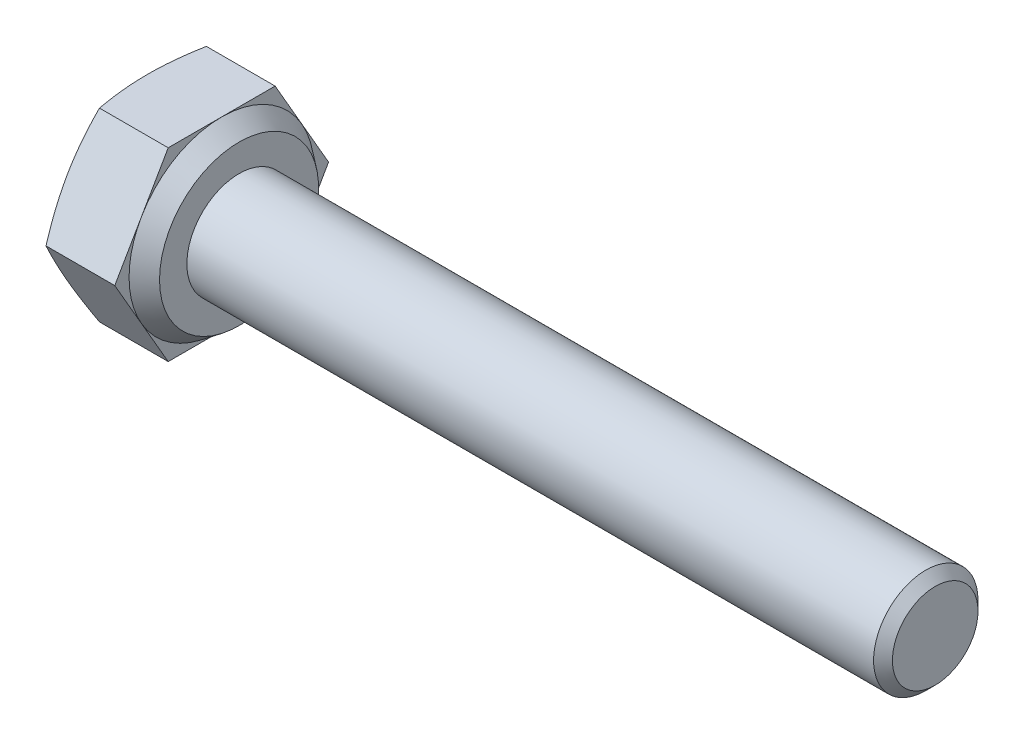
ISO-10303-21;
HEADER;
FILE_DESCRIPTION(('STEP AP214'),'2;1');
FILE_NAME('part.step','',(''),(''),'','','');
FILE_SCHEMA(('AUTOMOTIVE_DESIGN { 1 0 10303 214 1 1 1 1 }'));
ENDSEC;
DATA;
#1=APPLICATION_CONTEXT('core data for automotive mechanical design processes');
#2=APPLICATION_PROTOCOL_DEFINITION('international standard','automotive_design',2000,#1);
#3=PRODUCT_CONTEXT('',#1,'mechanical');
#4=PRODUCT('Part','Part','',(#3));
#5=PRODUCT_RELATED_PRODUCT_CATEGORY('part','',(#4));
#6=PRODUCT_DEFINITION_FORMATION('','',#4);
#7=PRODUCT_DEFINITION_CONTEXT('part definition',#1,'design');
#8=PRODUCT_DEFINITION('design','',#6,#7);
#9=PRODUCT_DEFINITION_SHAPE('','',#8);
#10=(LENGTH_UNIT() NAMED_UNIT(*) SI_UNIT(.MILLI.,.METRE.));
#11=(NAMED_UNIT(*) PLANE_ANGLE_UNIT() SI_UNIT($,.RADIAN.));
#12=(NAMED_UNIT(*) SI_UNIT($,.STERADIAN.) SOLID_ANGLE_UNIT());
#13=UNCERTAINTY_MEASURE_WITH_UNIT(LENGTH_MEASURE(1.E-05),#10,'distance_accuracy_value','');
#14=(GEOMETRIC_REPRESENTATION_CONTEXT(3) GLOBAL_UNCERTAINTY_ASSIGNED_CONTEXT((#13)) GLOBAL_UNIT_ASSIGNED_CONTEXT((#10,
#11,#12)) REPRESENTATION_CONTEXT('',''));
#15=CARTESIAN_POINT('',(0.,0.,0.));
#16=DIRECTION('',(0.,0.,1.));
#17=DIRECTION('',(1.,0.,0.));
#18=AXIS2_PLACEMENT_3D('',#15,#16,#17);
#19=CARTESIAN_POINT('',(2.62500000000001,0.,0.));
#20=DIRECTION('',(1.,0.,0.));
#21=DIRECTION('',(0.,0.,-1.));
#22=AXIS2_PLACEMENT_3D('',#19,#20,#21);
#23=PLANE('',#22);
#24=CARTESIAN_POINT('',(2.62500000000001,0.,0.));
#25=DIRECTION('',(-1.,0.,0.));
#26=DIRECTION('',(0.,0.,1.));
#27=AXIS2_PLACEMENT_3D('',#24,#25,#26);
#28=CIRCLE('',#27,2.285);
#29=CARTESIAN_POINT('',(2.62500000000001,0.,2.285));
#30=VERTEX_POINT('',#29);
#31=EDGE_CURVE('E146',#30,#30,#28,.T.);
#32=ORIENTED_EDGE('',*,*,#31,.F.);
#33=EDGE_LOOP('',(#32));
#34=FACE_BOUND('',#33,.T.);
#35=CARTESIAN_POINT('',(2.62500000000001,0.,0.));
#36=DIRECTION('',(1.,0.,0.));
#37=DIRECTION('',(0.,0.,-1.));
#38=AXIS2_PLACEMENT_3D('',#35,#36,#37);
#39=CIRCLE('',#38,1.5);
#40=CARTESIAN_POINT('',(2.62500000000001,0.,-1.5));
#41=VERTEX_POINT('',#40);
#42=EDGE_CURVE('E147',#41,#41,#39,.T.);
#43=ORIENTED_EDGE('',*,*,#42,.F.);
#44=EDGE_LOOP('',(#43));
#45=FACE_BOUND('',#44,.T.);
#46=ADVANCED_FACE('F43',(#34,#45),#23,.T.);
#47=CARTESIAN_POINT('',(2.125,-5.32,0.));
#48=DIRECTION('',(-1.,0.,0.));
#49=DIRECTION('',(0.,0.,1.));
#50=AXIS2_PLACEMENT_3D('',#47,#48,#49);
#51=PLANE('',#50);
#52=DIRECTION('',(0.,-0.866025403784439,0.5));
#53=VECTOR('',#52,1.);
#54=CARTESIAN_POINT('',(2.125,2.66,1.53575171604441));
#55=LINE('',#54,#53);
#56=CARTESIAN_POINT('',(2.125,2.66,1.53575171604441));
#57=VERTEX_POINT('',#56);
#58=CARTESIAN_POINT('',(2.125,1.33,2.30362757406662));
#59=VERTEX_POINT('',#58);
#60=EDGE_CURVE('E145',#57,#59,#55,.T.);
#61=ORIENTED_EDGE('',*,*,#60,.T.);
#62=CARTESIAN_POINT('',(2.125,0.,0.));
#63=DIRECTION('',(-1.,0.,0.));
#64=DIRECTION('',(0.,0.,1.));
#65=AXIS2_PLACEMENT_3D('',#62,#63,#64);
#66=CIRCLE('',#65,2.65999999999999);
#67=CARTESIAN_POINT('',(2.125,2.65999999999999,0.));
#68=VERTEX_POINT('',#67);
#69=EDGE_CURVE('E58',#59,#68,#66,.T.);
#70=ORIENTED_EDGE('',*,*,#69,.T.);
#71=DIRECTION('',(0.,0.,1.));
#72=VECTOR('',#71,1.);
#73=CARTESIAN_POINT('',(2.125,2.66,-1.53575171604438));
#74=LINE('',#73,#72);
#75=EDGE_CURVE('E142',#68,#57,#74,.T.);
#76=ORIENTED_EDGE('',*,*,#75,.T.);
#77=EDGE_LOOP('',(#61,#70,#76));
#78=FACE_BOUND('',#77,.T.);
#79=ADVANCED_FACE('F141',(#78),#51,.F.);
#80=CARTESIAN_POINT('',(2.125,2.66,-1.53575171604438));
#81=VERTEX_POINT('',#80);
#82=EDGE_CURVE('E154',#81,#68,#74,.T.);
#83=ORIENTED_EDGE('',*,*,#82,.T.);
#84=CARTESIAN_POINT('',(2.125,1.33,-2.3036275740666));
#85=VERTEX_POINT('',#84);
#86=EDGE_CURVE('E130',#68,#85,#66,.T.);
#87=ORIENTED_EDGE('',*,*,#86,.T.);
#88=DIRECTION('',(0.,0.866025403784439,0.5));
#89=VECTOR('',#88,1.);
#90=CARTESIAN_POINT('',(2.125,0.,-3.07150343208879));
#91=LINE('',#90,#89);
#92=EDGE_CURVE('E160',#85,#81,#91,.T.);
#93=ORIENTED_EDGE('',*,*,#92,.T.);
#94=EDGE_LOOP('',(#83,#87,#93));
#95=FACE_BOUND('',#94,.T.);
#96=ADVANCED_FACE('F159',(#95),#51,.F.);
#97=CARTESIAN_POINT('',(2.125,0.,-3.07150343208879));
#98=VERTEX_POINT('',#97);
#99=EDGE_CURVE('E157',#98,#85,#91,.T.);
#100=ORIENTED_EDGE('',*,*,#99,.T.);
#101=CARTESIAN_POINT('',(2.125,-1.33,-2.3036275740666));
#102=VERTEX_POINT('',#101);
#103=EDGE_CURVE('E133',#85,#102,#66,.T.);
#104=ORIENTED_EDGE('',*,*,#103,.T.);
#105=DIRECTION('',(0.,0.866025403784438,-0.500000000000001));
#106=VECTOR('',#105,1.);
#107=CARTESIAN_POINT('',(2.125,-2.65999999999999,-1.5357517160444));
#108=LINE('',#107,#106);
#109=EDGE_CURVE('E307',#102,#98,#108,.T.);
#110=ORIENTED_EDGE('',*,*,#109,.T.);
#111=EDGE_LOOP('',(#100,#104,#110));
#112=FACE_BOUND('',#111,.T.);
#113=ADVANCED_FACE('F413',(#112),#51,.F.);
#114=CARTESIAN_POINT('',(2.125,-2.65999999999999,-1.5357517160444));
#115=VERTEX_POINT('',#114);
#116=EDGE_CURVE('E305',#115,#102,#108,.T.);
#117=ORIENTED_EDGE('',*,*,#116,.T.);
#118=CARTESIAN_POINT('',(2.125,-2.65999999999999,0.));
#119=VERTEX_POINT('',#118);
#120=EDGE_CURVE('E372',#102,#119,#66,.T.);
#121=ORIENTED_EDGE('',*,*,#120,.T.);
#122=DIRECTION('',(0.,0.,-1.));
#123=VECTOR('',#122,1.);
#124=CARTESIAN_POINT('',(2.125,-2.66,1.53575171604441));
#125=LINE('',#124,#123);
#126=EDGE_CURVE('E171',#119,#115,#125,.T.);
#127=ORIENTED_EDGE('',*,*,#126,.T.);
#128=EDGE_LOOP('',(#117,#121,#127));
#129=FACE_BOUND('',#128,.T.);
#130=ADVANCED_FACE('F289',(#129),#51,.F.);
#131=CARTESIAN_POINT('',(2.125,-2.66,1.53575171604441));
#132=VERTEX_POINT('',#131);
#133=EDGE_CURVE('E172',#132,#119,#125,.T.);
#134=ORIENTED_EDGE('',*,*,#133,.T.);
#135=CARTESIAN_POINT('',(2.125,-1.33,2.3036275740666));
#136=VERTEX_POINT('',#135);
#137=EDGE_CURVE('E371',#119,#136,#66,.T.);
#138=ORIENTED_EDGE('',*,*,#137,.T.);
#139=DIRECTION('',(0.,-0.866025403784438,-0.500000000000001));
#140=VECTOR('',#139,1.);
#141=CARTESIAN_POINT('',(2.125,0.,3.07150343208882));
#142=LINE('',#141,#140);
#143=EDGE_CURVE('E167',#136,#132,#142,.T.);
#144=ORIENTED_EDGE('',*,*,#143,.T.);
#145=EDGE_LOOP('',(#134,#138,#144));
#146=FACE_BOUND('',#145,.T.);
#147=ADVANCED_FACE('F284',(#146),#51,.F.);
#148=CARTESIAN_POINT('',(2.125,-2.65999999999999,-1.5357517160444));
#149=DIRECTION('',(0.,0.500000000000001,0.866025403784438));
#150=DIRECTION('',(0.,-0.866025403784438,0.500000000000001));
#151=AXIS2_PLACEMENT_3D('',#148,#149,#150);
#152=PLANE('',#151);
#153=CARTESIAN_POINT('',(0.14981703061114,0.000199999999985593,-3.07161890214263));
#154=CARTESIAN_POINT('',(0.126655267106296,-0.109972901445074,-3.00801054783593));
#155=CARTESIAN_POINT('',(0.105585516514746,-0.220509139821142,-2.94419242085429));
#156=CARTESIAN_POINT('',(0.068516405368849,-0.44230043794413,-2.81614115517907));
#157=CARTESIAN_POINT('',(0.0525210136848932,-0.553555991244305,-2.75190773153237));
#158=CARTESIAN_POINT('',(0.0266488737348927,-0.77555105379868,-2.62373882240784));
#159=CARTESIAN_POINT('',(0.016715686362451,-0.88628549161727,-2.55980626492471));
#160=CARTESIAN_POINT('',(0.00339247663623487,-1.10801336149001,-2.43179161956684));
#161=CARTESIAN_POINT('',(0.,-1.21900668074501,-2.36770959681672));
#162=CARTESIAN_POINT('',(0.,-1.440993319255,-2.23954555131647));
#163=CARTESIAN_POINT('',(0.00339247663623504,-1.55198663851,-2.17546352856635));
#164=CARTESIAN_POINT('',(0.0167156863624516,-1.77371450838274,-2.04744888320848));
#165=CARTESIAN_POINT('',(0.0266488737348935,-1.88444894620133,-1.98351632572536));
#166=CARTESIAN_POINT('',(0.0525210136848944,-2.1064440087557,-1.85534741660082));
#167=CARTESIAN_POINT('',(0.0685164053688502,-2.21769956205588,-1.79111399295413));
#168=CARTESIAN_POINT('',(0.105585516514748,-2.43949086017886,-1.6630627272789));
#169=CARTESIAN_POINT('',(0.126655267106297,-2.55002709855493,-1.59924460029727));
#170=CARTESIAN_POINT('',(0.149817030611141,-2.66019999999999,-1.53563624599056));
#171=B_SPLINE_CURVE_WITH_KNOTS('',3,(#153,#154,#155,#156,#157,#158,#159,#160,#161,#162,#163,
#164,#165,#166,#167,#168,#169,#170),.UNSPECIFIED.,.F.,.F.,(4,2,2,2,2,2,2,2,4),(0.,
0.387964021749805,0.776230742659475,1.16082524860915,1.54527541437403,1.92972558013891,
2.31432008608859,2.70258680699826,3.09055082874807),.UNSPECIFIED.);
#172=CARTESIAN_POINT('',(0.149775000578702,0.,-3.0715034320888));
#173=VERTEX_POINT('',#172);
#174=CARTESIAN_POINT('',(0.,-1.33,-2.30362757406661));
#175=VERTEX_POINT('',#174);
#176=EDGE_CURVE('E294',#173,#175,#171,.T.);
#177=ORIENTED_EDGE('',*,*,#176,.F.);
#178=DIRECTION('',(-1.,0.,0.));
#179=VECTOR('',#178,1.);
#180=CARTESIAN_POINT('',(2.125,0.,-3.07150343208879));
#181=LINE('',#180,#179);
#182=EDGE_CURVE('E187',#98,#173,#181,.T.);
#183=ORIENTED_EDGE('',*,*,#182,.F.);
#184=ORIENTED_EDGE('',*,*,#109,.F.);
#185=ORIENTED_EDGE('',*,*,#116,.F.);
#186=DIRECTION('',(-1.,0.,0.));
#187=VECTOR('',#186,1.);
#188=CARTESIAN_POINT('',(2.125,-2.65999999999999,-1.5357517160444));
#189=LINE('',#188,#187);
#190=CARTESIAN_POINT('',(0.149775000578702,-2.65999999999999,-1.53575171604439));
#191=VERTEX_POINT('',#190);
#192=EDGE_CURVE('E175',#115,#191,#189,.T.);
#193=ORIENTED_EDGE('',*,*,#192,.T.);
#194=EDGE_CURVE('E250',#175,#191,#171,.T.);
#195=ORIENTED_EDGE('',*,*,#194,.F.);
#196=EDGE_LOOP('',(#177,#183,#184,#185,#193,#195));
#197=FACE_BOUND('',#196,.T.);
#198=ADVANCED_FACE('F279',(#197),#152,.F.);
#199=CARTESIAN_POINT('',(2.125,0.,-3.07150343208879));
#200=DIRECTION('',(0.,-0.5,0.866025403784439));
#201=DIRECTION('',(0.,-0.866025403784439,-0.5));
#202=AXIS2_PLACEMENT_3D('',#199,#200,#201);
#203=PLANE('',#202);
#204=CARTESIAN_POINT('',(0.149817030611141,2.6602,-1.53563624599054));
#205=CARTESIAN_POINT('',(0.126655267106297,2.55002709855494,-1.59924460029725));
#206=CARTESIAN_POINT('',(0.105585516514746,2.43949086017887,-1.66306272727888));
#207=CARTESIAN_POINT('',(0.0685164053688474,2.21769956205588,-1.79111399295411));
#208=CARTESIAN_POINT('',(0.052521013684891,2.1064440087557,-1.85534741660081));
#209=CARTESIAN_POINT('',(0.0266488737348894,1.88444894620133,-1.98351632572534));
#210=CARTESIAN_POINT('',(0.0167156863624473,1.77371450838273,-2.04744888320847));
#211=CARTESIAN_POINT('',(0.00339247663623036,1.55198663850999,-2.17546352856634));
#212=CARTESIAN_POINT('',(0.,1.44099331925499,-2.23954555131646));
#213=CARTESIAN_POINT('',(0.,1.219006680745,-2.36770959681671));
#214=CARTESIAN_POINT('',(0.00339247663623016,1.10801336149,-2.43179161956684));
#215=CARTESIAN_POINT('',(0.0167156863624469,0.886285491617254,-2.55980626492471));
#216=CARTESIAN_POINT('',(0.0266488737348889,0.775551053798663,-2.62373882240783));
#217=CARTESIAN_POINT('',(0.0525210136848903,0.553555991244284,-2.75190773153237));
#218=CARTESIAN_POINT('',(0.0685164053688465,0.442300437944107,-2.81614115517907));
#219=CARTESIAN_POINT('',(0.105585516514745,0.220509139821116,-2.94419242085429));
#220=CARTESIAN_POINT('',(0.126655267106295,0.109972901445047,-3.00801054783592));
#221=CARTESIAN_POINT('',(0.14981703061114,-0.000200000000014874,-3.07161890214263));
#222=B_SPLINE_CURVE_WITH_KNOTS('',3,(#204,#205,#206,#207,#208,#209,#210,#211,#212,#213,#214,
#215,#216,#217,#218,#219,#220,#221),.UNSPECIFIED.,.F.,.F.,(4,2,2,2,2,2,2,2,4),(0.,
0.38796402174981,0.776230742659486,1.16082524860917,1.54527541437406,1.92972558013894,
2.31432008608863,2.7025868069983,3.09055082874811),.UNSPECIFIED.);
#223=CARTESIAN_POINT('',(0.149775000578702,2.66,-1.53575171604438));
#224=VERTEX_POINT('',#223);
#225=CARTESIAN_POINT('',(0.,1.33,-2.30362757406661));
#226=VERTEX_POINT('',#225);
#227=EDGE_CURVE('E269',#224,#226,#222,.T.);
#228=ORIENTED_EDGE('',*,*,#227,.F.);
#229=DIRECTION('',(-1.,0.,0.));
#230=VECTOR('',#229,1.);
#231=CARTESIAN_POINT('',(2.125,2.66,-1.53575171604438));
#232=LINE('',#231,#230);
#233=EDGE_CURVE('E185',#81,#224,#232,.T.);
#234=ORIENTED_EDGE('',*,*,#233,.F.);
#235=ORIENTED_EDGE('',*,*,#92,.F.);
#236=ORIENTED_EDGE('',*,*,#99,.F.);
#237=ORIENTED_EDGE('',*,*,#182,.T.);
#238=EDGE_CURVE('E263',#226,#173,#222,.T.);
#239=ORIENTED_EDGE('',*,*,#238,.F.);
#240=EDGE_LOOP('',(#228,#234,#235,#236,#237,#239));
#241=FACE_BOUND('',#240,.T.);
#242=ADVANCED_FACE('F276',(#241),#203,.F.);
#243=CARTESIAN_POINT('',(2.125,2.66,-1.53575171604438));
#244=DIRECTION('',(0.,-1.,0.));
#245=DIRECTION('',(0.,0.,-1.));
#246=AXIS2_PLACEMENT_3D('',#243,#244,#245);
#247=PLANE('',#246);
#248=CARTESIAN_POINT('',(0.800338205556512,2.66,-4.06613053666247));
#249=CARTESIAN_POINT('',(0.763692247959132,2.66,-3.94578245367177));
#250=CARTESIAN_POINT('',(0.727473947036799,2.66,-3.82530183652318));
#251=CARTESIAN_POINT('',(0.656129119080206,2.66,-3.58400782474573));
#252=CARTESIAN_POINT('',(0.621002678438525,2.66,-3.46319440460327));
#253=CARTESIAN_POINT('',(0.55201959898391,2.66,-3.220960292383));
#254=CARTESIAN_POINT('',(0.518165451580184,2.66,-3.09953888784182));
#255=CARTESIAN_POINT('',(0.452123762840513,2.66,-2.85624515783478));
#256=CARTESIAN_POINT('',(0.419936191580807,2.66,-2.73437284050728));
#257=CARTESIAN_POINT('',(0.358023031432937,2.66,-2.49160023859959));
#258=CARTESIAN_POINT('',(0.328271956913645,2.66,-2.37070652482605));
#259=CARTESIAN_POINT('',(0.271306915968192,2.66,-2.12832438948567));
#260=CARTESIAN_POINT('',(0.244093065146206,2.66,-2.00683594108597));
#261=CARTESIAN_POINT('',(0.167186674155655,2.66,-1.64142901791089));
#262=CARTESIAN_POINT('',(0.122197331545068,2.66,-1.39644838090809));
#263=CARTESIAN_POINT('',(0.070827125790737,2.66,-1.04074258548546));
#264=CARTESIAN_POINT('',(0.0568876505205054,2.66,-0.93110222748264));
#265=CARTESIAN_POINT('',(0.033294504284707,2.66,-0.711365736155275));
#266=CARTESIAN_POINT('',(0.0236403007729952,2.66,-0.60126966118167));
#267=CARTESIAN_POINT('',(0.00907749588974812,2.66,-0.380832711529686));
#268=CARTESIAN_POINT('',(0.00416576292894789,2.66,-0.270492046681792));
#269=CARTESIAN_POINT('',(-0.000661852880589213,2.66,-0.0497001450953424));
#270=CARTESIAN_POINT('',(-0.000577771009307559,2.66,0.060751090856861));
#271=CARTESIAN_POINT('',(0.00459443689217557,2.66,0.282092841090725));
#272=CARTESIAN_POINT('',(0.00970784898942928,2.66,0.392982754539467));
#273=CARTESIAN_POINT('',(0.0247038697532597,2.66,0.614440745519416));
#274=CARTESIAN_POINT('',(0.03458676347277,2.66,0.725008803417194));
#275=CARTESIAN_POINT('',(0.0586582312427899,2.66,0.94576301102998));
#276=CARTESIAN_POINT('',(0.0728504267995482,2.66,1.05594876037488));
#277=CARTESIAN_POINT('',(0.104968729037743,2.66,1.27576754132662));
#278=CARTESIAN_POINT('',(0.122894855731609,2.66,1.38540056996787));
#279=CARTESIAN_POINT('',(0.18343827025732,2.66,1.72501827930751));
#280=CARTESIAN_POINT('',(0.23144044191464,2.66,1.95404028341545));
#281=CARTESIAN_POINT('',(0.336683107122955,2.66,2.40995741942189));
#282=CARTESIAN_POINT('',(0.393926928122444,2.66,2.63685175400439));
#283=CARTESIAN_POINT('',(0.514573252677107,2.66,3.08929571117377));
#284=CARTESIAN_POINT('',(0.577983629009016,2.66,3.31484321401066));
#285=CARTESIAN_POINT('',(0.708883670397929,2.66,3.76470051446876));
#286=CARTESIAN_POINT('',(0.776372688199038,2.66,3.98901050234269));
#287=CARTESIAN_POINT('',(0.91341260825536,2.66,4.43428675422166));
#288=CARTESIAN_POINT('',(0.98293252910636,2.66,4.65526259706082));
#289=CARTESIAN_POINT('',(1.12394706969548,2.66,5.09659289632888));
#290=CARTESIAN_POINT('',(1.19544178417762,2.66,5.31694732238337));
#291=CARTESIAN_POINT('',(1.33959659474569,2.66,5.75634755098196));
#292=CARTESIAN_POINT('',(1.41225123965053,2.66,5.97539514643887));
#293=CARTESIAN_POINT('',(1.55864986808486,2.66,6.41310625609133));
#294=CARTESIAN_POINT('',(1.6323937613982,2.66,6.63176980043568));
#295=CARTESIAN_POINT('',(1.70651873059576,2.66,6.85030222465687));
#296=B_SPLINE_CURVE_WITH_KNOTS('',3,(#248,#249,#250,#251,#252,#253,#254,#255,#256,#257,#258,
#259,#260,#261,#262,#263,#264,#265,#266,#267,#268,#269,#270,#271,#272,#273,#274,#275,#276,#277,
#278,#279,#280,#281,#282,#283,#284,#285,#286,#287,#288,#289,#290,#291,#292,#293,#294,#295),
.UNSPECIFIED.,.F.,.F.,(4,2,2,2,2,2,2,2,2,2,2,2,2,2,2,2,2,2,2,2,2,2,2,4),(0.,0.377413762307762,
0.754857311554839,1.13300507623747,1.51114604883308,1.88461936707443,2.25810969366917,
3.004716363312,3.3362177639897,3.66767795625326,3.99891912585881,4.33015795627019,
4.66307072046098,4.99600338398719,5.32921661978193,5.6624316415169,6.36408571540328,
7.06599298501462,7.76880844002568,8.47151265383813,9.16646049091442,9.86144172738192,
10.5537859620286,11.2460731718104),.UNSPECIFIED.);
#297=CARTESIAN_POINT('',(0.149775000578703,2.65999999999997,1.53575171604443));
#298=VERTEX_POINT('',#297);
#299=CARTESIAN_POINT('',(0.,2.66,0.));
#300=VERTEX_POINT('',#299);
#301=EDGE_CURVE('E311',#298,#300,#296,.F.);
#302=ORIENTED_EDGE('',*,*,#301,.F.);
#303=DIRECTION('',(-1.,0.,0.));
#304=VECTOR('',#303,1.);
#305=CARTESIAN_POINT('',(2.125,2.66,1.53575171604441));
#306=LINE('',#305,#304);
#307=EDGE_CURVE('E156',#57,#298,#306,.T.);
#308=ORIENTED_EDGE('',*,*,#307,.F.);
#309=ORIENTED_EDGE('',*,*,#75,.F.);
#310=ORIENTED_EDGE('',*,*,#82,.F.);
#311=ORIENTED_EDGE('',*,*,#233,.T.);
#312=EDGE_CURVE('E270',#300,#224,#296,.F.);
#313=ORIENTED_EDGE('',*,*,#312,.F.);
#314=EDGE_LOOP('',(#302,#308,#309,#310,#311,#313));
#315=FACE_BOUND('',#314,.T.);
#316=ADVANCED_FACE('F152',(#315),#247,.F.);
#317=CARTESIAN_POINT('',(2.125,2.66,1.53575171604441));
#318=DIRECTION('',(0.,-0.5,-0.866025403784439));
#319=DIRECTION('',(0.,0.866025403784439,-0.5));
#320=AXIS2_PLACEMENT_3D('',#317,#318,#319);
#321=PLANE('',#320);
#322=CARTESIAN_POINT('',(0.149817030611147,-0.000199999999996324,3.07161890214266));
#323=CARTESIAN_POINT('',(0.126655267106303,0.109972901445064,3.00801054783595));
#324=CARTESIAN_POINT('',(0.105585516514754,0.220509139821133,2.94419242085432));
#325=CARTESIAN_POINT('',(0.0685164053688557,0.442300437944122,2.81614115517909));
#326=CARTESIAN_POINT('',(0.0525210136848998,0.553555991244299,2.7519077315324));
#327=CARTESIAN_POINT('',(0.0266488737348987,0.775551053798676,2.62373882240786));
#328=CARTESIAN_POINT('',(0.0167156863624568,0.886285491617266,2.55980626492473));
#329=CARTESIAN_POINT('',(0.00339247663624018,1.10801336149001,2.43179161956686));
#330=CARTESIAN_POINT('',(0.,1.21900668074501,2.36770959681674));
#331=CARTESIAN_POINT('',(0.,1.440993319255,2.23954555131649));
#332=CARTESIAN_POINT('',(0.00339247663624023,1.55198663851,2.17546352856637));
#333=CARTESIAN_POINT('',(0.0167156863624567,1.77371450838274,2.0474488832085));
#334=CARTESIAN_POINT('',(0.0266488737348984,1.88444894620133,1.98351632572538));
#335=CARTESIAN_POINT('',(0.0525210136848992,2.10644400875571,1.85534741660084));
#336=CARTESIAN_POINT('',(0.0685164053688551,2.21769956205588,1.79111399295414));
#337=CARTESIAN_POINT('',(0.105585516514753,2.43949086017887,1.66306272727892));
#338=CARTESIAN_POINT('',(0.126655267106303,2.55002709855494,1.59924460029728));
#339=CARTESIAN_POINT('',(0.149817030611147,2.6602,1.53563624599058));
#340=B_SPLINE_CURVE_WITH_KNOTS('',3,(#322,#323,#324,#325,#326,#327,#328,#329,#330,#331,#332,
#333,#334,#335,#336,#337,#338,#339),.UNSPECIFIED.,.F.,.F.,(4,2,2,2,2,2,2,2,4),(0.,
0.387964021749807,0.77623074265948,1.16082524860916,1.54527541437404,1.92972558013893,
2.31432008608861,2.70258680699828,3.09055082874809),.UNSPECIFIED.);
#341=CARTESIAN_POINT('',(0.149775000578703,0.,3.0715034320888));
#342=VERTEX_POINT('',#341);
#343=CARTESIAN_POINT('',(0.,1.33,2.30362757406661));
#344=VERTEX_POINT('',#343);
#345=EDGE_CURVE('E256',#342,#344,#340,.T.);
#346=ORIENTED_EDGE('',*,*,#345,.F.);
#347=DIRECTION('',(-1.,0.,0.));
#348=VECTOR('',#347,1.);
#349=CARTESIAN_POINT('',(2.125,0.,3.07150343208882));
#350=LINE('',#349,#348);
#351=CARTESIAN_POINT('',(2.125,0.,3.07150343208882));
#352=VERTEX_POINT('',#351);
#353=EDGE_CURVE('E181',#352,#342,#350,.T.);
#354=ORIENTED_EDGE('',*,*,#353,.F.);
#355=EDGE_CURVE('E162',#59,#352,#55,.T.);
#356=ORIENTED_EDGE('',*,*,#355,.F.);
#357=ORIENTED_EDGE('',*,*,#60,.F.);
#358=ORIENTED_EDGE('',*,*,#307,.T.);
#359=EDGE_CURVE('E313',#344,#298,#340,.T.);
#360=ORIENTED_EDGE('',*,*,#359,.F.);
#361=EDGE_LOOP('',(#346,#354,#356,#357,#358,#360));
#362=FACE_BOUND('',#361,.T.);
#363=ADVANCED_FACE('F356',(#362),#321,.F.);
#364=CARTESIAN_POINT('',(2.125,0.,3.07150343208882));
#365=DIRECTION('',(0.,0.500000000000001,-0.866025403784438));
#366=DIRECTION('',(0.,0.866025403784438,0.500000000000001));
#367=AXIS2_PLACEMENT_3D('',#364,#365,#366);
#368=PLANE('',#367);
#369=CARTESIAN_POINT('',(0.149817030611144,-2.6602,1.53563624599058));
#370=CARTESIAN_POINT('',(0.1266552671063,-2.55002709855494,1.59924460029728));
#371=CARTESIAN_POINT('',(0.10558551651475,-2.43949086017887,1.66306272727892));
#372=CARTESIAN_POINT('',(0.0685164053688529,-2.21769956205588,1.79111399295414));
#373=CARTESIAN_POINT('',(0.0525210136848972,-2.1064440087557,1.85534741660084));
#374=CARTESIAN_POINT('',(0.0266488737348964,-1.88444894620132,1.98351632572537));
#375=CARTESIAN_POINT('',(0.0167156863624546,-1.77371450838273,2.0474488832085));
#376=CARTESIAN_POINT('',(0.00339247663623825,-1.55198663850999,2.17546352856637));
#377=CARTESIAN_POINT('',(0.,-1.44099331925499,2.23954555131649));
#378=CARTESIAN_POINT('',(0.,-1.219006680745,2.36770959681674));
#379=CARTESIAN_POINT('',(0.00339247663623897,-1.10801336149,2.43179161956686));
#380=CARTESIAN_POINT('',(0.0167156863624559,-0.886285491617259,2.55980626492473));
#381=CARTESIAN_POINT('',(0.0266488737348979,-0.775551053798668,2.62373882240786));
#382=CARTESIAN_POINT('',(0.0525210136848992,-0.553555991244291,2.7519077315324));
#383=CARTESIAN_POINT('',(0.0685164053688553,-0.442300437944115,2.81614115517909));
#384=CARTESIAN_POINT('',(0.105585516514753,-0.220509139821126,2.94419242085432));
#385=CARTESIAN_POINT('',(0.126655267106304,-0.109972901445057,3.00801054783595));
#386=CARTESIAN_POINT('',(0.149817030611148,0.000200000000003816,3.07161890214266));
#387=B_SPLINE_CURVE_WITH_KNOTS('',3,(#369,#370,#371,#372,#373,#374,#375,#376,#377,#378,#379,
#380,#381,#382,#383,#384,#385,#386),.UNSPECIFIED.,.F.,.F.,(4,2,2,2,2,2,2,2,4),(0.,
0.387964021749807,0.776230742659481,1.16082524860916,1.54527541437405,1.92972558013893,
2.31432008608861,2.70258680699828,3.09055082874809),.UNSPECIFIED.);
#388=CARTESIAN_POINT('',(0.149775000578703,-2.66,1.53575171604439));
#389=VERTEX_POINT('',#388);
#390=CARTESIAN_POINT('',(0.,-1.33,2.30362757406661));
#391=VERTEX_POINT('',#390);
#392=EDGE_CURVE('E242',#389,#391,#387,.T.);
#393=ORIENTED_EDGE('',*,*,#392,.F.);
#394=DIRECTION('',(-1.,0.,0.));
#395=VECTOR('',#394,1.);
#396=CARTESIAN_POINT('',(2.125,-2.66,1.53575171604441));
#397=LINE('',#396,#395);
#398=EDGE_CURVE('E178',#132,#389,#397,.T.);
#399=ORIENTED_EDGE('',*,*,#398,.F.);
#400=ORIENTED_EDGE('',*,*,#143,.F.);
#401=EDGE_CURVE('E168',#352,#136,#142,.T.);
#402=ORIENTED_EDGE('',*,*,#401,.F.);
#403=ORIENTED_EDGE('',*,*,#353,.T.);
#404=EDGE_CURVE('E299',#391,#342,#387,.T.);
#405=ORIENTED_EDGE('',*,*,#404,.F.);
#406=EDGE_LOOP('',(#393,#399,#400,#402,#403,#405));
#407=FACE_BOUND('',#406,.T.);
#408=ADVANCED_FACE('F352',(#407),#368,.F.);
#409=CARTESIAN_POINT('',(2.125,-2.66,1.53575171604441));
#410=DIRECTION('',(0.,1.,0.));
#411=DIRECTION('',(0.,0.,1.));
#412=AXIS2_PLACEMENT_3D('',#409,#410,#411);
#413=PLANE('',#412);
#414=CARTESIAN_POINT('',(0.800338205556513,-2.65999999999999,-4.06613053666248));
#415=CARTESIAN_POINT('',(0.763692247959134,-2.65999999999999,-3.94578245367179));
#416=CARTESIAN_POINT('',(0.727473947036801,-2.65999999999999,-3.82530183652319));
#417=CARTESIAN_POINT('',(0.656129119080208,-2.65999999999999,-3.58400782474574));
#418=CARTESIAN_POINT('',(0.621002678438527,-2.65999999999999,-3.46319440460328));
#419=CARTESIAN_POINT('',(0.552019598983912,-2.65999999999999,-3.22096029238301));
#420=CARTESIAN_POINT('',(0.518165451580185,-2.65999999999999,-3.09953888784184));
#421=CARTESIAN_POINT('',(0.452123762840514,-2.65999999999999,-2.85624515783479));
#422=CARTESIAN_POINT('',(0.419936191580809,-2.65999999999999,-2.7343728405073));
#423=CARTESIAN_POINT('',(0.358023031432939,-2.65999999999999,-2.49160023859961));
#424=CARTESIAN_POINT('',(0.328271956913647,-2.65999999999999,-2.37070652482607));
#425=CARTESIAN_POINT('',(0.271306915968192,-2.65999999999999,-2.12832438948569));
#426=CARTESIAN_POINT('',(0.244093065146207,-2.65999999999999,-2.00683594108599));
#427=CARTESIAN_POINT('',(0.167186674155655,-2.65999999999999,-1.64142901791091));
#428=CARTESIAN_POINT('',(0.122197331545068,-2.65999999999999,-1.39644838090811));
#429=CARTESIAN_POINT('',(0.0708271257907362,-2.65999999999999,-1.04074258548548));
#430=CARTESIAN_POINT('',(0.0568876505205043,-2.65999999999999,-0.931102227482659));
#431=CARTESIAN_POINT('',(0.0332945042847055,-2.65999999999999,-0.711365736155295));
#432=CARTESIAN_POINT('',(0.0236403007729935,-2.65999999999999,-0.601269661181689));
#433=CARTESIAN_POINT('',(0.00907749588974592,-2.65999999999999,-0.380832711529706));
#434=CARTESIAN_POINT('',(0.00416576292894538,-2.65999999999999,-0.270492046681811));
#435=CARTESIAN_POINT('',(-0.000661852880592189,-2.65999999999999,-0.0497001450953612));
#436=CARTESIAN_POINT('',(-0.000577771009310698,-2.65999999999999,0.0607510908568422));
#437=CARTESIAN_POINT('',(0.00459443689217191,-2.65999999999999,0.282092841090706));
#438=CARTESIAN_POINT('',(0.00970784898942526,-2.65999999999999,0.392982754539448));
#439=CARTESIAN_POINT('',(0.0247038697532553,-2.65999999999999,0.614440745519397));
#440=CARTESIAN_POINT('',(0.0345867634727654,-2.65999999999999,0.725008803417175));
#441=CARTESIAN_POINT('',(0.058658231242785,-2.65999999999999,0.945763011029961));
#442=CARTESIAN_POINT('',(0.0728504267995432,-2.66,1.05594876037486));
#443=CARTESIAN_POINT('',(0.104968729037738,-2.66,1.2757675413266));
#444=CARTESIAN_POINT('',(0.122894855731603,-2.66,1.38540056996785));
#445=CARTESIAN_POINT('',(0.183438270257314,-2.66,1.72501827930749));
#446=CARTESIAN_POINT('',(0.231440441914635,-2.66,1.95404028341544));
#447=CARTESIAN_POINT('',(0.336683107122951,-2.66,2.40995741942188));
#448=CARTESIAN_POINT('',(0.393926928122439,-2.66,2.63685175400438));
#449=CARTESIAN_POINT('',(0.514573252677103,-2.66,3.08929571117376));
#450=CARTESIAN_POINT('',(0.577983629009013,-2.66,3.31484321401065));
#451=CARTESIAN_POINT('',(0.708883670397926,-2.66,3.76470051446875));
#452=CARTESIAN_POINT('',(0.776372688199036,-2.66,3.98901050234268));
#453=CARTESIAN_POINT('',(0.91341260825536,-2.66,4.43428675422166));
#454=CARTESIAN_POINT('',(0.982932529106359,-2.66,4.65526259706082));
#455=CARTESIAN_POINT('',(1.12394706969548,-2.66,5.09659289632888));
#456=CARTESIAN_POINT('',(1.19544178417762,-2.66,5.31694732238338));
#457=CARTESIAN_POINT('',(1.33959659474569,-2.66,5.75634755098197));
#458=CARTESIAN_POINT('',(1.41225123965053,-2.66,5.97539514643888));
#459=CARTESIAN_POINT('',(1.55864986808487,-2.66,6.41310625609134));
#460=CARTESIAN_POINT('',(1.63239376139821,-2.66,6.63176980043569));
#461=CARTESIAN_POINT('',(1.70651873059577,-2.66,6.85030222465688));
#462=B_SPLINE_CURVE_WITH_KNOTS('',3,(#414,#415,#416,#417,#418,#419,#420,#421,#422,#423,#424,
#425,#426,#427,#428,#429,#430,#431,#432,#433,#434,#435,#436,#437,#438,#439,#440,#441,#442,#443,
#444,#445,#446,#447,#448,#449,#450,#451,#452,#453,#454,#455,#456,#457,#458,#459,#460,#461),
.UNSPECIFIED.,.F.,.F.,(4,2,2,2,2,2,2,2,2,2,2,2,2,2,2,2,2,2,2,2,2,2,2,4),(0.,0.377413762307762,
0.754857311554839,1.13300507623747,1.51114604883308,1.88461936707443,2.25810969366917,
3.00471636331199,3.33621776398969,3.66767795625326,3.99891912585881,4.33015795627019,
4.66307072046098,4.99600338398719,5.32921661978193,5.66243164151689,6.36408571540328,
7.06599298501463,7.76880844002569,8.47151265383815,9.16646049091444,9.86144172738194,
10.5537859620286,11.2460731718104),.UNSPECIFIED.);
#463=CARTESIAN_POINT('',(0.,-2.65999999999999,0.));
#464=VERTEX_POINT('',#463);
#465=EDGE_CURVE('E321',#191,#464,#462,.T.);
#466=ORIENTED_EDGE('',*,*,#465,.F.);
#467=ORIENTED_EDGE('',*,*,#192,.F.);
#468=ORIENTED_EDGE('',*,*,#126,.F.);
#469=ORIENTED_EDGE('',*,*,#133,.F.);
#470=ORIENTED_EDGE('',*,*,#398,.T.);
#471=EDGE_CURVE('E231',#464,#389,#462,.T.);
#472=ORIENTED_EDGE('',*,*,#471,.F.);
#473=EDGE_LOOP('',(#466,#467,#468,#469,#470,#472));
#474=FACE_BOUND('',#473,.T.);
#475=ADVANCED_FACE('F349',(#474),#413,.F.);
#476=ORIENTED_EDGE('',*,*,#401,.T.);
#477=EDGE_CURVE('E148',#136,#59,#66,.T.);
#478=ORIENTED_EDGE('',*,*,#477,.T.);
#479=ORIENTED_EDGE('',*,*,#355,.T.);
#480=EDGE_LOOP('',(#476,#478,#479));
#481=FACE_BOUND('',#480,.T.);
#482=ADVANCED_FACE('F215',(#481),#51,.F.);
#483=CARTESIAN_POINT('',(0.,0.,0.));
#484=DIRECTION('',(1.,0.,0.));
#485=DIRECTION('',(0.,0.,-1.));
#486=AXIS2_PLACEMENT_3D('',#483,#484,#485);
#487=CONICAL_SURFACE('',#486,2.66,1.22173047639604);
#488=ORIENTED_EDGE('',*,*,#345,.T.);
#489=CARTESIAN_POINT('',(0.,0.,0.));
#490=DIRECTION('',(-1.,0.,0.));
#491=DIRECTION('',(0.,0.,1.));
#492=AXIS2_PLACEMENT_3D('',#489,#490,#491);
#493=CIRCLE('',#492,2.66000000000001);
#494=EDGE_CURVE('E190',#391,#344,#493,.T.);
#495=ORIENTED_EDGE('',*,*,#494,.F.);
#496=ORIENTED_EDGE('',*,*,#404,.T.);
#497=EDGE_LOOP('',(#488,#495,#496));
#498=FACE_BOUND('',#497,.T.);
#499=ADVANCED_FACE('F379',(#498),#487,.T.);
#500=ORIENTED_EDGE('',*,*,#392,.T.);
#501=EDGE_CURVE('E192',#464,#391,#493,.T.);
#502=ORIENTED_EDGE('',*,*,#501,.F.);
#503=ORIENTED_EDGE('',*,*,#471,.T.);
#504=EDGE_LOOP('',(#500,#502,#503));
#505=FACE_BOUND('',#504,.T.);
#506=ADVANCED_FACE('F226',(#505),#487,.T.);
#507=ORIENTED_EDGE('',*,*,#194,.T.);
#508=ORIENTED_EDGE('',*,*,#465,.T.);
#509=EDGE_CURVE('E375',#175,#464,#493,.T.);
#510=ORIENTED_EDGE('',*,*,#509,.F.);
#511=EDGE_LOOP('',(#507,#508,#510));
#512=FACE_BOUND('',#511,.T.);
#513=ADVANCED_FACE('F378',(#512),#487,.T.);
#514=ORIENTED_EDGE('',*,*,#238,.T.);
#515=ORIENTED_EDGE('',*,*,#176,.T.);
#516=EDGE_CURVE('E373',#226,#175,#493,.T.);
#517=ORIENTED_EDGE('',*,*,#516,.F.);
#518=EDGE_LOOP('',(#514,#515,#517));
#519=FACE_BOUND('',#518,.T.);
#520=ADVANCED_FACE('F384',(#519),#487,.T.);
#521=ORIENTED_EDGE('',*,*,#312,.T.);
#522=ORIENTED_EDGE('',*,*,#227,.T.);
#523=EDGE_CURVE('E193',#300,#226,#493,.T.);
#524=ORIENTED_EDGE('',*,*,#523,.F.);
#525=EDGE_LOOP('',(#521,#522,#524));
#526=FACE_BOUND('',#525,.T.);
#527=ADVANCED_FACE('F225',(#526),#487,.T.);
#528=ORIENTED_EDGE('',*,*,#301,.T.);
#529=CARTESIAN_POINT('',(0.,0.,0.));
#530=DIRECTION('',(-1.,0.,0.));
#531=DIRECTION('',(0.,0.,1.));
#532=AXIS2_PLACEMENT_3D('',#529,#530,#531);
#533=CIRCLE('',#532,2.66);
#534=EDGE_CURVE('E66',#344,#300,#533,.T.);
#535=ORIENTED_EDGE('',*,*,#534,.F.);
#536=ORIENTED_EDGE('',*,*,#359,.T.);
#537=EDGE_LOOP('',(#528,#535,#536));
#538=FACE_BOUND('',#537,.T.);
#539=ADVANCED_FACE('F221',(#538),#487,.T.);
#540=CARTESIAN_POINT('',(0.,-5.32,0.));
#541=DIRECTION('',(-1.,0.,0.));
#542=DIRECTION('',(0.,0.,1.));
#543=AXIS2_PLACEMENT_3D('',#540,#541,#542);
#544=PLANE('',#543);
#545=ORIENTED_EDGE('',*,*,#494,.T.);
#546=ORIENTED_EDGE('',*,*,#534,.T.);
#547=ORIENTED_EDGE('',*,*,#523,.T.);
#548=ORIENTED_EDGE('',*,*,#516,.T.);
#549=ORIENTED_EDGE('',*,*,#509,.T.);
#550=ORIENTED_EDGE('',*,*,#501,.T.);
#551=EDGE_LOOP('',(#545,#546,#547,#548,#549,#550));
#552=FACE_BOUND('',#551,.T.);
#553=ADVANCED_FACE('F224',(#552),#544,.T.);
#554=CARTESIAN_POINT('',(2.125,0.,0.));
#555=DIRECTION('',(-1.,0.,0.));
#556=DIRECTION('',(0.,0.,1.));
#557=AXIS2_PLACEMENT_3D('',#554,#555,#556);
#558=CONICAL_SURFACE('',#557,2.65999999999999,0.643501108793268);
#559=ORIENTED_EDGE('',*,*,#31,.T.);
#560=EDGE_LOOP('',(#559));
#561=FACE_BOUND('',#560,.T.);
#562=ORIENTED_EDGE('',*,*,#69,.F.);
#563=ORIENTED_EDGE('',*,*,#477,.F.);
#564=ORIENTED_EDGE('',*,*,#137,.F.);
#565=ORIENTED_EDGE('',*,*,#120,.F.);
#566=ORIENTED_EDGE('',*,*,#103,.F.);
#567=ORIENTED_EDGE('',*,*,#86,.F.);
#568=EDGE_LOOP('',(#562,#563,#564,#565,#566,#567));
#569=FACE_BOUND('',#568,.T.);
#570=ADVANCED_FACE('F131',(#561,#569),#558,.T.);
#571=CARTESIAN_POINT('',(22.625,0.,0.));
#572=DIRECTION('',(-1.,0.,0.));
#573=DIRECTION('',(0.,0.,1.));
#574=AXIS2_PLACEMENT_3D('',#571,#572,#573);
#575=CYLINDRICAL_SURFACE('',#574,1.5);
#576=CARTESIAN_POINT('',(22.3545,0.,0.));
#577=DIRECTION('',(1.,0.,0.));
#578=DIRECTION('',(0.,0.,-1.));
#579=AXIS2_PLACEMENT_3D('',#576,#577,#578);
#580=CIRCLE('',#579,1.5);
#581=CARTESIAN_POINT('',(22.3545,0.,-1.5));
#582=VERTEX_POINT('',#581);
#583=EDGE_CURVE('E11',#582,#582,#580,.F.);
#584=ORIENTED_EDGE('',*,*,#583,.T.);
#585=EDGE_LOOP('',(#584));
#586=FACE_BOUND('',#585,.T.);
#587=ORIENTED_EDGE('',*,*,#42,.T.);
#588=EDGE_LOOP('',(#587));
#589=FACE_BOUND('',#588,.T.);
#590=ADVANCED_FACE('F204',(#586,#589),#575,.T.);
#591=CARTESIAN_POINT('',(22.625,0.,0.));
#592=DIRECTION('',(1.,0.,0.));
#593=DIRECTION('',(0.,0.,-1.));
#594=AXIS2_PLACEMENT_3D('',#591,#592,#593);
#595=PLANE('',#594);
#596=CARTESIAN_POINT('',(22.625,0.,0.));
#597=DIRECTION('',(1.,0.,0.));
#598=DIRECTION('',(0.,0.,-1.));
#599=AXIS2_PLACEMENT_3D('',#596,#597,#598);
#600=CIRCLE('',#599,1.22949999999999);
#601=CARTESIAN_POINT('',(22.625,0.,-1.2295));
#602=VERTEX_POINT('',#601);
#603=EDGE_CURVE('E51',#602,#602,#600,.T.);
#604=ORIENTED_EDGE('',*,*,#603,.T.);
#605=EDGE_LOOP('',(#604));
#606=FACE_BOUND('',#605,.T.);
#607=ADVANCED_FACE('F197',(#606),#595,.T.);
#608=CARTESIAN_POINT('',(22.625,0.,0.));
#609=DIRECTION('',(-1.,0.,0.));
#610=DIRECTION('',(0.,0.,1.));
#611=AXIS2_PLACEMENT_3D('',#608,#609,#610);
#612=CONICAL_SURFACE('',#611,1.22949999999999,0.785398163397446);
#613=ORIENTED_EDGE('',*,*,#583,.F.);
#614=EDGE_LOOP('',(#613));
#615=FACE_BOUND('',#614,.T.);
#616=ORIENTED_EDGE('',*,*,#603,.F.);
#617=EDGE_LOOP('',(#616));
#618=FACE_BOUND('',#617,.T.);
#619=ADVANCED_FACE('F45',(#615,#618),#612,.T.);
#620=CLOSED_SHELL('',(#46,#79,#96,#113,#130,#147,#198,#242,#316,#363,#408,#475,#482,#499,#506,
#513,#520,#527,#539,#553,#570,#590,#607,#619));
#621=MANIFOLD_SOLID_BREP('B2',#620);
#622=ADVANCED_BREP_SHAPE_REPRESENTATION('',(#18,#621),#14);
#623=SHAPE_DEFINITION_REPRESENTATION(#9,#622);
ENDSEC;
END-ISO-10303-21;
